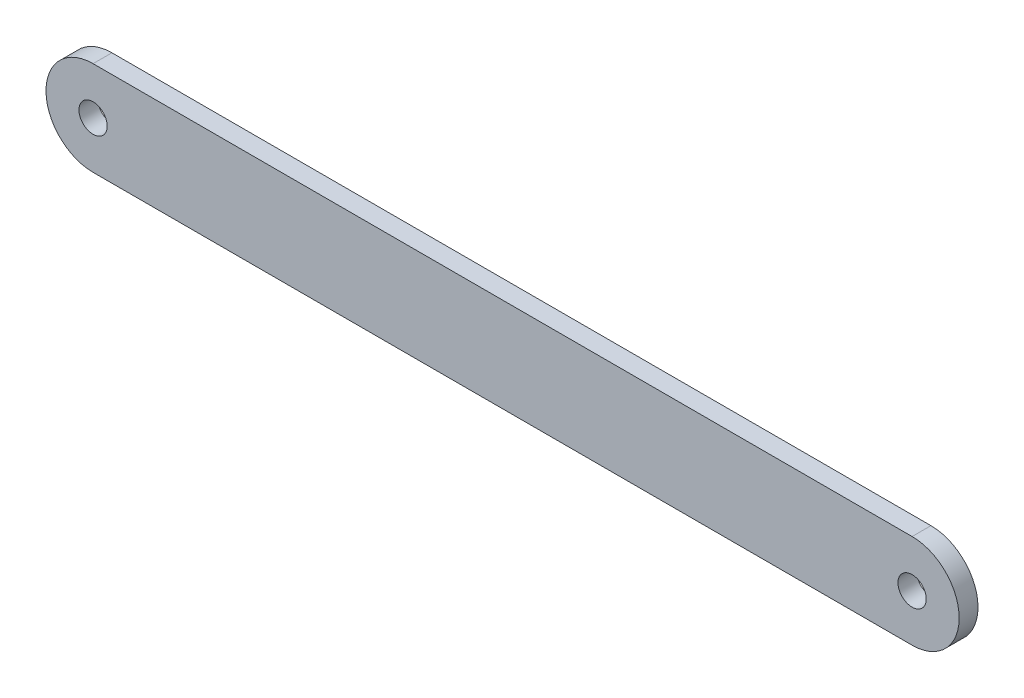
ISO-10303-21;
HEADER;
FILE_DESCRIPTION(('STEP AP214'),'2;1');
FILE_NAME('part.step','',(''),(''),'','','');
FILE_SCHEMA(('AUTOMOTIVE_DESIGN { 1 0 10303 214 1 1 1 1 }'));
ENDSEC;
DATA;
#1=APPLICATION_CONTEXT('core data for automotive mechanical design processes');
#2=APPLICATION_PROTOCOL_DEFINITION('international standard','automotive_design',2000,#1);
#3=PRODUCT_CONTEXT('',#1,'mechanical');
#4=PRODUCT('Part','Part','',(#3));
#5=PRODUCT_RELATED_PRODUCT_CATEGORY('part','',(#4));
#6=PRODUCT_DEFINITION_FORMATION('','',#4);
#7=PRODUCT_DEFINITION_CONTEXT('part definition',#1,'design');
#8=PRODUCT_DEFINITION('design','',#6,#7);
#9=PRODUCT_DEFINITION_SHAPE('','',#8);
#10=(LENGTH_UNIT() NAMED_UNIT(*) SI_UNIT(.MILLI.,.METRE.));
#11=(NAMED_UNIT(*) PLANE_ANGLE_UNIT() SI_UNIT($,.RADIAN.));
#12=(NAMED_UNIT(*) SI_UNIT($,.STERADIAN.) SOLID_ANGLE_UNIT());
#13=UNCERTAINTY_MEASURE_WITH_UNIT(LENGTH_MEASURE(1.E-05),#10,'distance_accuracy_value','');
#14=(GEOMETRIC_REPRESENTATION_CONTEXT(3) GLOBAL_UNCERTAINTY_ASSIGNED_CONTEXT((#13)) GLOBAL_UNIT_ASSIGNED_CONTEXT((#10,
#11,#12)) REPRESENTATION_CONTEXT('',''));
#15=CARTESIAN_POINT('',(0.,0.,0.));
#16=DIRECTION('',(0.,0.,1.));
#17=DIRECTION('',(1.,0.,0.));
#18=AXIS2_PLACEMENT_3D('',#15,#16,#17);
#19=CARTESIAN_POINT('',(-43.5,0.,2.));
#20=DIRECTION('',(0.,0.,1.));
#21=DIRECTION('',(1.,0.,0.));
#22=AXIS2_PLACEMENT_3D('',#19,#20,#21);
#23=PLANE('',#22);
#24=CARTESIAN_POINT('',(-43.5,0.,2.));
#25=DIRECTION('',(0.,0.,1.));
#26=DIRECTION('',(1.,0.,0.));
#27=AXIS2_PLACEMENT_3D('',#24,#25,#26);
#28=CIRCLE('',#27,1.5);
#29=CARTESIAN_POINT('',(-42.,0.,2.));
#30=VERTEX_POINT('',#29);
#31=EDGE_CURVE('E100',#30,#30,#28,.T.);
#32=ORIENTED_EDGE('',*,*,#31,.F.);
#33=EDGE_LOOP('',(#32));
#34=FACE_BOUND('',#33,.T.);
#35=CARTESIAN_POINT('',(-43.5,0.,2.));
#36=DIRECTION('',(0.,0.,1.));
#37=DIRECTION('',(1.,0.,0.));
#38=AXIS2_PLACEMENT_3D('',#35,#36,#37);
#39=CIRCLE('',#38,5.);
#40=CARTESIAN_POINT('',(-43.5,5.,2.));
#41=VERTEX_POINT('',#40);
#42=CARTESIAN_POINT('',(-43.5,-5.,2.));
#43=VERTEX_POINT('',#42);
#44=EDGE_CURVE('E85',#41,#43,#39,.T.);
#45=ORIENTED_EDGE('',*,*,#44,.T.);
#46=DIRECTION('',(1.,0.,0.));
#47=VECTOR('',#46,1.);
#48=CARTESIAN_POINT('',(-43.5,-5.,2.));
#49=LINE('',#48,#47);
#50=CARTESIAN_POINT('',(43.5,-4.99999999999999,2.));
#51=VERTEX_POINT('',#50);
#52=EDGE_CURVE('E80',#43,#51,#49,.T.);
#53=ORIENTED_EDGE('',*,*,#52,.T.);
#54=CARTESIAN_POINT('',(43.5,0.,2.));
#55=DIRECTION('',(0.,0.,1.));
#56=DIRECTION('',(1.,0.,0.));
#57=AXIS2_PLACEMENT_3D('',#54,#55,#56);
#58=CIRCLE('',#57,5.);
#59=CARTESIAN_POINT('',(43.5,5.00000000000002,2.));
#60=VERTEX_POINT('',#59);
#61=EDGE_CURVE('E83',#51,#60,#58,.T.);
#62=ORIENTED_EDGE('',*,*,#61,.T.);
#63=DIRECTION('',(-1.,0.,0.));
#64=VECTOR('',#63,1.);
#65=CARTESIAN_POINT('',(-43.5,5.,2.));
#66=LINE('',#65,#64);
#67=EDGE_CURVE('E50',#60,#41,#66,.T.);
#68=ORIENTED_EDGE('',*,*,#67,.T.);
#69=EDGE_LOOP('',(#45,#53,#62,#68));
#70=FACE_BOUND('',#69,.T.);
#71=CARTESIAN_POINT('',(43.5,0.,2.));
#72=DIRECTION('',(0.,0.,1.));
#73=DIRECTION('',(1.,0.,0.));
#74=AXIS2_PLACEMENT_3D('',#71,#72,#73);
#75=CIRCLE('',#74,1.5);
#76=CARTESIAN_POINT('',(45.,0.,2.));
#77=VERTEX_POINT('',#76);
#78=EDGE_CURVE('E115',#77,#77,#75,.T.);
#79=ORIENTED_EDGE('',*,*,#78,.F.);
#80=EDGE_LOOP('',(#79));
#81=FACE_BOUND('',#80,.T.);
#82=ADVANCED_FACE('F33',(#34,#70,#81),#23,.T.);
#83=CARTESIAN_POINT('',(-43.5,0.,0.));
#84=DIRECTION('',(0.,0.,1.));
#85=DIRECTION('',(1.,0.,0.));
#86=AXIS2_PLACEMENT_3D('',#83,#84,#85);
#87=PLANE('',#86);
#88=CARTESIAN_POINT('',(-43.5,0.,0.));
#89=DIRECTION('',(0.,0.,1.));
#90=DIRECTION('',(1.,0.,0.));
#91=AXIS2_PLACEMENT_3D('',#88,#89,#90);
#92=CIRCLE('',#91,5.);
#93=CARTESIAN_POINT('',(-43.5,5.,0.));
#94=VERTEX_POINT('',#93);
#95=CARTESIAN_POINT('',(-43.5,-5.,0.));
#96=VERTEX_POINT('',#95);
#97=EDGE_CURVE('E97',#94,#96,#92,.T.);
#98=ORIENTED_EDGE('',*,*,#97,.F.);
#99=DIRECTION('',(-1.,0.,0.));
#100=VECTOR('',#99,1.);
#101=CARTESIAN_POINT('',(-43.5,5.,0.));
#102=LINE('',#101,#100);
#103=CARTESIAN_POINT('',(43.5,5.00000000000002,0.));
#104=VERTEX_POINT('',#103);
#105=EDGE_CURVE('E73',#104,#94,#102,.T.);
#106=ORIENTED_EDGE('',*,*,#105,.F.);
#107=CARTESIAN_POINT('',(43.5,0.,0.));
#108=DIRECTION('',(0.,0.,1.));
#109=DIRECTION('',(1.,0.,0.));
#110=AXIS2_PLACEMENT_3D('',#107,#108,#109);
#111=CIRCLE('',#110,5.);
#112=CARTESIAN_POINT('',(43.5,-4.99999999999999,0.));
#113=VERTEX_POINT('',#112);
#114=EDGE_CURVE('E67',#113,#104,#111,.T.);
#115=ORIENTED_EDGE('',*,*,#114,.F.);
#116=DIRECTION('',(1.,0.,0.));
#117=VECTOR('',#116,1.);
#118=CARTESIAN_POINT('',(-43.5,-5.,0.));
#119=LINE('',#118,#117);
#120=EDGE_CURVE('E89',#96,#113,#119,.T.);
#121=ORIENTED_EDGE('',*,*,#120,.F.);
#122=EDGE_LOOP('',(#98,#106,#115,#121));
#123=FACE_BOUND('',#122,.T.);
#124=CARTESIAN_POINT('',(-43.5,0.,0.));
#125=DIRECTION('',(0.,0.,1.));
#126=DIRECTION('',(1.,0.,0.));
#127=AXIS2_PLACEMENT_3D('',#124,#125,#126);
#128=CIRCLE('',#127,1.5);
#129=CARTESIAN_POINT('',(-42.,0.,0.));
#130=VERTEX_POINT('',#129);
#131=EDGE_CURVE('E112',#130,#130,#128,.T.);
#132=ORIENTED_EDGE('',*,*,#131,.T.);
#133=EDGE_LOOP('',(#132));
#134=FACE_BOUND('',#133,.T.);
#135=CARTESIAN_POINT('',(43.5,0.,0.));
#136=DIRECTION('',(0.,0.,1.));
#137=DIRECTION('',(1.,0.,0.));
#138=AXIS2_PLACEMENT_3D('',#135,#136,#137);
#139=CIRCLE('',#138,1.5);
#140=CARTESIAN_POINT('',(45.,0.,0.));
#141=VERTEX_POINT('',#140);
#142=EDGE_CURVE('E118',#141,#141,#139,.T.);
#143=ORIENTED_EDGE('',*,*,#142,.T.);
#144=EDGE_LOOP('',(#143));
#145=FACE_BOUND('',#144,.T.);
#146=ADVANCED_FACE('F108',(#123,#134,#145),#87,.F.);
#147=CARTESIAN_POINT('',(-43.5,0.,2.));
#148=DIRECTION('',(0.,0.,-1.));
#149=DIRECTION('',(-1.,0.,0.));
#150=AXIS2_PLACEMENT_3D('',#147,#148,#149);
#151=CYLINDRICAL_SURFACE('',#150,5.);
#152=ORIENTED_EDGE('',*,*,#97,.T.);
#153=DIRECTION('',(0.,0.,-1.));
#154=VECTOR('',#153,1.);
#155=CARTESIAN_POINT('',(-43.5,-5.,2.));
#156=LINE('',#155,#154);
#157=EDGE_CURVE('E11',#43,#96,#156,.T.);
#158=ORIENTED_EDGE('',*,*,#157,.F.);
#159=ORIENTED_EDGE('',*,*,#44,.F.);
#160=DIRECTION('',(0.,0.,-1.));
#161=VECTOR('',#160,1.);
#162=CARTESIAN_POINT('',(-43.5,5.,2.));
#163=LINE('',#162,#161);
#164=EDGE_CURVE('E93',#41,#94,#163,.T.);
#165=ORIENTED_EDGE('',*,*,#164,.T.);
#166=EDGE_LOOP('',(#152,#158,#159,#165));
#167=FACE_BOUND('',#166,.T.);
#168=ADVANCED_FACE('F35',(#167),#151,.T.);
#169=CARTESIAN_POINT('',(-43.5,-5.,2.));
#170=DIRECTION('',(0.,1.,0.));
#171=DIRECTION('',(-1.,0.,0.));
#172=AXIS2_PLACEMENT_3D('',#169,#170,#171);
#173=PLANE('',#172);
#174=ORIENTED_EDGE('',*,*,#120,.T.);
#175=DIRECTION('',(0.,0.,-1.));
#176=VECTOR('',#175,1.);
#177=CARTESIAN_POINT('',(43.5,-4.99999999999999,2.));
#178=LINE('',#177,#176);
#179=EDGE_CURVE('E42',#51,#113,#178,.T.);
#180=ORIENTED_EDGE('',*,*,#179,.F.);
#181=ORIENTED_EDGE('',*,*,#52,.F.);
#182=ORIENTED_EDGE('',*,*,#157,.T.);
#183=EDGE_LOOP('',(#174,#180,#181,#182));
#184=FACE_BOUND('',#183,.T.);
#185=ADVANCED_FACE('F88',(#184),#173,.F.);
#186=CARTESIAN_POINT('',(43.5,0.,2.));
#187=DIRECTION('',(0.,0.,-1.));
#188=DIRECTION('',(-1.,0.,0.));
#189=AXIS2_PLACEMENT_3D('',#186,#187,#188);
#190=CYLINDRICAL_SURFACE('',#189,5.);
#191=ORIENTED_EDGE('',*,*,#114,.T.);
#192=DIRECTION('',(0.,0.,-1.));
#193=VECTOR('',#192,1.);
#194=CARTESIAN_POINT('',(43.5,5.00000000000002,2.));
#195=LINE('',#194,#193);
#196=EDGE_CURVE('E90',#60,#104,#195,.T.);
#197=ORIENTED_EDGE('',*,*,#196,.F.);
#198=ORIENTED_EDGE('',*,*,#61,.F.);
#199=ORIENTED_EDGE('',*,*,#179,.T.);
#200=EDGE_LOOP('',(#191,#197,#198,#199));
#201=FACE_BOUND('',#200,.T.);
#202=ADVANCED_FACE('F91',(#201),#190,.T.);
#203=CARTESIAN_POINT('',(-43.5,5.,2.));
#204=DIRECTION('',(0.,-1.,0.));
#205=DIRECTION('',(1.,0.,0.));
#206=AXIS2_PLACEMENT_3D('',#203,#204,#205);
#207=PLANE('',#206);
#208=ORIENTED_EDGE('',*,*,#105,.T.);
#209=ORIENTED_EDGE('',*,*,#164,.F.);
#210=ORIENTED_EDGE('',*,*,#67,.F.);
#211=ORIENTED_EDGE('',*,*,#196,.T.);
#212=EDGE_LOOP('',(#208,#209,#210,#211));
#213=FACE_BOUND('',#212,.T.);
#214=ADVANCED_FACE('F105',(#213),#207,.F.);
#215=CARTESIAN_POINT('',(-43.5,0.,2.));
#216=DIRECTION('',(0.,0.,-1.));
#217=DIRECTION('',(-1.,0.,0.));
#218=AXIS2_PLACEMENT_3D('',#215,#216,#217);
#219=CYLINDRICAL_SURFACE('',#218,1.5);
#220=ORIENTED_EDGE('',*,*,#31,.T.);
#221=EDGE_LOOP('',(#220));
#222=FACE_BOUND('',#221,.T.);
#223=ORIENTED_EDGE('',*,*,#131,.F.);
#224=EDGE_LOOP('',(#223));
#225=FACE_BOUND('',#224,.T.);
#226=ADVANCED_FACE('F135',(#222,#225),#219,.F.);
#227=CARTESIAN_POINT('',(43.5,0.,2.));
#228=DIRECTION('',(0.,0.,-1.));
#229=DIRECTION('',(-1.,0.,0.));
#230=AXIS2_PLACEMENT_3D('',#227,#228,#229);
#231=CYLINDRICAL_SURFACE('',#230,1.5);
#232=ORIENTED_EDGE('',*,*,#78,.T.);
#233=EDGE_LOOP('',(#232));
#234=FACE_BOUND('',#233,.T.);
#235=ORIENTED_EDGE('',*,*,#142,.F.);
#236=EDGE_LOOP('',(#235));
#237=FACE_BOUND('',#236,.T.);
#238=ADVANCED_FACE('F124',(#234,#237),#231,.F.);
#239=CLOSED_SHELL('',(#82,#146,#168,#185,#202,#214,#226,#238));
#240=MANIFOLD_SOLID_BREP('B2',#239);
#241=ADVANCED_BREP_SHAPE_REPRESENTATION('',(#18,#240),#14);
#242=SHAPE_DEFINITION_REPRESENTATION(#9,#241);
ENDSEC;
END-ISO-10303-21;
